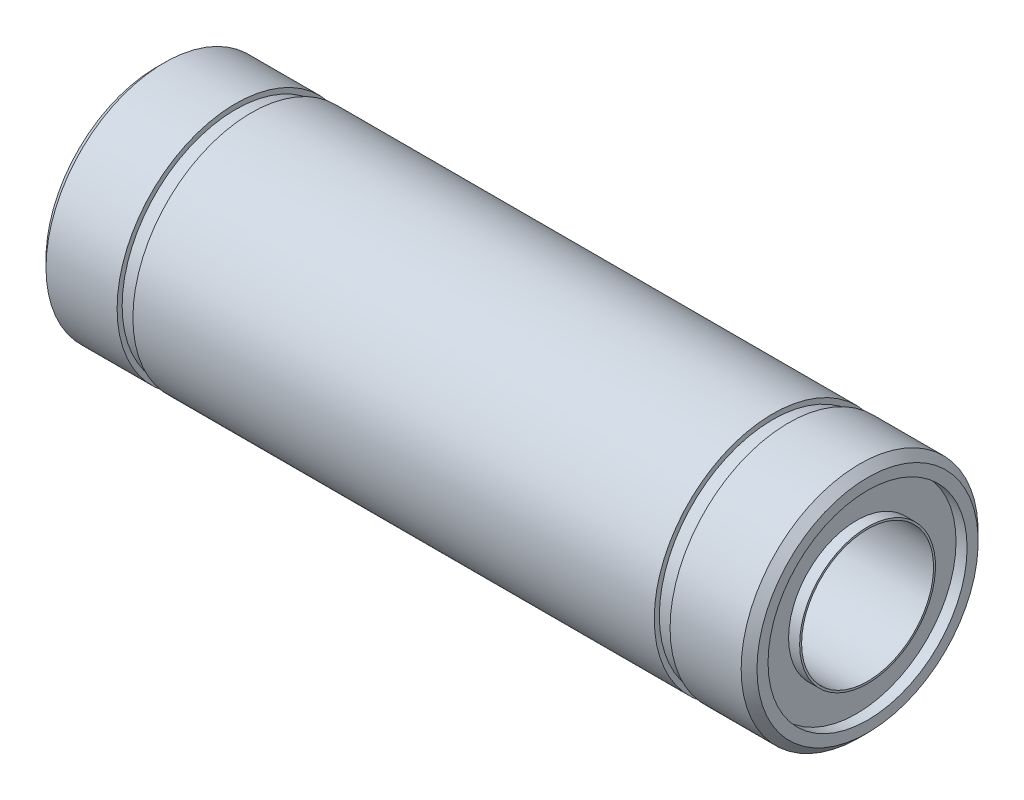
ISO-10303-21;
HEADER;
FILE_DESCRIPTION(('STEP AP214'),'2;1');
FILE_NAME('part.step','',(''),(''),'','','');
FILE_SCHEMA(('AUTOMOTIVE_DESIGN { 1 0 10303 214 1 1 1 1 }'));
ENDSEC;
DATA;
#1=APPLICATION_CONTEXT('core data for automotive mechanical design processes');
#2=APPLICATION_PROTOCOL_DEFINITION('international standard','automotive_design',2000,#1);
#3=PRODUCT_CONTEXT('',#1,'mechanical');
#4=PRODUCT('Part','Part','',(#3));
#5=PRODUCT_RELATED_PRODUCT_CATEGORY('part','',(#4));
#6=PRODUCT_DEFINITION_FORMATION('','',#4);
#7=PRODUCT_DEFINITION_CONTEXT('part definition',#1,'design');
#8=PRODUCT_DEFINITION('design','',#6,#7);
#9=PRODUCT_DEFINITION_SHAPE('','',#8);
#10=(LENGTH_UNIT() NAMED_UNIT(*) SI_UNIT(.MILLI.,.METRE.));
#11=(NAMED_UNIT(*) PLANE_ANGLE_UNIT() SI_UNIT($,.RADIAN.));
#12=(NAMED_UNIT(*) SI_UNIT($,.STERADIAN.) SOLID_ANGLE_UNIT());
#13=UNCERTAINTY_MEASURE_WITH_UNIT(LENGTH_MEASURE(1.E-05),#10,'distance_accuracy_value','');
#14=(GEOMETRIC_REPRESENTATION_CONTEXT(3) GLOBAL_UNCERTAINTY_ASSIGNED_CONTEXT((#13)) GLOBAL_UNIT_ASSIGNED_CONTEXT((#10,
#11,#12)) REPRESENTATION_CONTEXT('',''));
#15=CARTESIAN_POINT('',(0.,0.,0.));
#16=DIRECTION('',(0.,0.,1.));
#17=DIRECTION('',(1.,0.,0.));
#18=AXIS2_PLACEMENT_3D('',#15,#16,#17);
#19=CARTESIAN_POINT('',(0.,7.5,0.));
#20=DIRECTION('',(1.,0.,0.));
#21=DIRECTION('',(0.,0.,-1.));
#22=AXIS2_PLACEMENT_3D('',#19,#20,#21);
#23=PLANE('',#22);
#24=CARTESIAN_POINT('',(0.,0.,0.));
#25=DIRECTION('',(1.,0.,0.));
#26=DIRECTION('',(0.,0.,-1.));
#27=AXIS2_PLACEMENT_3D('',#24,#25,#26);
#28=CIRCLE('',#27,7.);
#29=CARTESIAN_POINT('',(0.,0.,-7.));
#30=VERTEX_POINT('',#29);
#31=EDGE_CURVE('E42',#30,#30,#28,.F.);
#32=ORIENTED_EDGE('',*,*,#31,.T.);
#33=EDGE_LOOP('',(#32));
#34=FACE_BOUND('',#33,.T.);
#35=CARTESIAN_POINT('',(0.,0.,0.));
#36=DIRECTION('',(-1.,0.,0.));
#37=DIRECTION('',(0.,0.,1.));
#38=AXIS2_PLACEMENT_3D('',#35,#36,#37);
#39=CIRCLE('',#38,6.3);
#40=CARTESIAN_POINT('',(0.,0.,6.3));
#41=VERTEX_POINT('',#40);
#42=EDGE_CURVE('E55',#41,#41,#39,.T.);
#43=ORIENTED_EDGE('',*,*,#42,.F.);
#44=EDGE_LOOP('',(#43));
#45=FACE_BOUND('',#44,.T.);
#46=ADVANCED_FACE('F35',(#34,#45),#23,.F.);
#47=CARTESIAN_POINT('',(0.,0.,0.));
#48=DIRECTION('',(-1.,0.,0.));
#49=DIRECTION('',(0.,0.,1.));
#50=AXIS2_PLACEMENT_3D('',#47,#48,#49);
#51=CYLINDRICAL_SURFACE('',#50,6.3);
#52=CARTESIAN_POINT('',(0.7,0.,0.));
#53=DIRECTION('',(-1.,0.,0.));
#54=DIRECTION('',(0.,0.,1.));
#55=AXIS2_PLACEMENT_3D('',#52,#53,#54);
#56=CIRCLE('',#55,6.3);
#57=CARTESIAN_POINT('',(0.7,0.,6.3));
#58=VERTEX_POINT('',#57);
#59=EDGE_CURVE('E58',#58,#58,#56,.T.);
#60=ORIENTED_EDGE('',*,*,#59,.F.);
#61=EDGE_LOOP('',(#60));
#62=FACE_BOUND('',#61,.T.);
#63=ORIENTED_EDGE('',*,*,#42,.T.);
#64=EDGE_LOOP('',(#63));
#65=FACE_BOUND('',#64,.T.);
#66=ADVANCED_FACE('F166',(#62,#65),#51,.F.);
#67=CARTESIAN_POINT('',(0.7,6.3,0.));
#68=DIRECTION('',(1.,0.,0.));
#69=DIRECTION('',(0.,0.,-1.));
#70=AXIS2_PLACEMENT_3D('',#67,#68,#69);
#71=PLANE('',#70);
#72=CARTESIAN_POINT('',(0.7,0.,0.));
#73=DIRECTION('',(-1.,0.,0.));
#74=DIRECTION('',(0.,0.,1.));
#75=AXIS2_PLACEMENT_3D('',#72,#73,#74);
#76=CIRCLE('',#75,4.3);
#77=CARTESIAN_POINT('',(0.7,0.,4.3));
#78=VERTEX_POINT('',#77);
#79=EDGE_CURVE('E61',#78,#78,#76,.T.);
#80=ORIENTED_EDGE('',*,*,#79,.F.);
#81=EDGE_LOOP('',(#80));
#82=FACE_BOUND('',#81,.T.);
#83=ORIENTED_EDGE('',*,*,#59,.T.);
#84=EDGE_LOOP('',(#83));
#85=FACE_BOUND('',#84,.T.);
#86=ADVANCED_FACE('F171',(#82,#85),#71,.F.);
#87=CARTESIAN_POINT('',(0.,0.,0.));
#88=DIRECTION('',(-1.,0.,0.));
#89=DIRECTION('',(0.,0.,1.));
#90=AXIS2_PLACEMENT_3D('',#87,#88,#89);
#91=CYLINDRICAL_SURFACE('',#90,4.3);
#92=CARTESIAN_POINT('',(0.,0.,0.));
#93=DIRECTION('',(-1.,0.,0.));
#94=DIRECTION('',(0.,0.,1.));
#95=AXIS2_PLACEMENT_3D('',#92,#93,#94);
#96=CIRCLE('',#95,4.3);
#97=CARTESIAN_POINT('',(0.,0.,4.3));
#98=VERTEX_POINT('',#97);
#99=EDGE_CURVE('E64',#98,#98,#96,.T.);
#100=ORIENTED_EDGE('',*,*,#99,.F.);
#101=EDGE_LOOP('',(#100));
#102=FACE_BOUND('',#101,.T.);
#103=ORIENTED_EDGE('',*,*,#79,.T.);
#104=EDGE_LOOP('',(#103));
#105=FACE_BOUND('',#104,.T.);
#106=ADVANCED_FACE('F223',(#102,#105),#91,.T.);
#107=CARTESIAN_POINT('',(0.,4.3,0.));
#108=DIRECTION('',(1.,0.,0.));
#109=DIRECTION('',(0.,0.,-1.));
#110=AXIS2_PLACEMENT_3D('',#107,#108,#109);
#111=PLANE('',#110);
#112=CARTESIAN_POINT('',(0.,0.,0.));
#113=DIRECTION('',(-1.,0.,0.));
#114=DIRECTION('',(0.,0.,1.));
#115=AXIS2_PLACEMENT_3D('',#112,#113,#114);
#116=CIRCLE('',#115,4.175);
#117=CARTESIAN_POINT('',(0.,0.,4.175));
#118=VERTEX_POINT('',#117);
#119=EDGE_CURVE('E67',#118,#118,#116,.T.);
#120=ORIENTED_EDGE('',*,*,#119,.F.);
#121=EDGE_LOOP('',(#120));
#122=FACE_BOUND('',#121,.T.);
#123=ORIENTED_EDGE('',*,*,#99,.T.);
#124=EDGE_LOOP('',(#123));
#125=FACE_BOUND('',#124,.T.);
#126=ADVANCED_FACE('F217',(#122,#125),#111,.F.);
#127=CARTESIAN_POINT('',(0.,0.,0.));
#128=DIRECTION('',(-1.,0.,0.));
#129=DIRECTION('',(0.,0.,1.));
#130=AXIS2_PLACEMENT_3D('',#127,#128,#129);
#131=CYLINDRICAL_SURFACE('',#130,4.175);
#132=CARTESIAN_POINT('',(45.,0.,0.));
#133=DIRECTION('',(-1.,0.,0.));
#134=DIRECTION('',(0.,0.,1.));
#135=AXIS2_PLACEMENT_3D('',#132,#133,#134);
#136=CIRCLE('',#135,4.175);
#137=CARTESIAN_POINT('',(45.,0.,4.175));
#138=VERTEX_POINT('',#137);
#139=EDGE_CURVE('E70',#138,#138,#136,.T.);
#140=ORIENTED_EDGE('',*,*,#139,.F.);
#141=EDGE_LOOP('',(#140));
#142=FACE_BOUND('',#141,.T.);
#143=ORIENTED_EDGE('',*,*,#119,.T.);
#144=EDGE_LOOP('',(#143));
#145=FACE_BOUND('',#144,.T.);
#146=ADVANCED_FACE('F211',(#142,#145),#131,.F.);
#147=CARTESIAN_POINT('',(45.,4.3,0.));
#148=DIRECTION('',(-1.,0.,0.));
#149=DIRECTION('',(0.,0.,1.));
#150=AXIS2_PLACEMENT_3D('',#147,#148,#149);
#151=PLANE('',#150);
#152=CARTESIAN_POINT('',(45.,0.,0.));
#153=DIRECTION('',(-1.,0.,0.));
#154=DIRECTION('',(0.,0.,1.));
#155=AXIS2_PLACEMENT_3D('',#152,#153,#154);
#156=CIRCLE('',#155,4.3);
#157=CARTESIAN_POINT('',(45.,0.,4.3));
#158=VERTEX_POINT('',#157);
#159=EDGE_CURVE('E73',#158,#158,#156,.T.);
#160=ORIENTED_EDGE('',*,*,#159,.F.);
#161=EDGE_LOOP('',(#160));
#162=FACE_BOUND('',#161,.T.);
#163=ORIENTED_EDGE('',*,*,#139,.T.);
#164=EDGE_LOOP('',(#163));
#165=FACE_BOUND('',#164,.T.);
#166=ADVANCED_FACE('F205',(#162,#165),#151,.F.);
#167=CARTESIAN_POINT('',(0.,0.,0.));
#168=DIRECTION('',(-1.,0.,0.));
#169=DIRECTION('',(0.,0.,1.));
#170=AXIS2_PLACEMENT_3D('',#167,#168,#169);
#171=CYLINDRICAL_SURFACE('',#170,4.3);
#172=CARTESIAN_POINT('',(44.3,0.,0.));
#173=DIRECTION('',(-1.,0.,0.));
#174=DIRECTION('',(0.,0.,1.));
#175=AXIS2_PLACEMENT_3D('',#172,#173,#174);
#176=CIRCLE('',#175,4.3);
#177=CARTESIAN_POINT('',(44.3,0.,4.3));
#178=VERTEX_POINT('',#177);
#179=EDGE_CURVE('E76',#178,#178,#176,.T.);
#180=ORIENTED_EDGE('',*,*,#179,.F.);
#181=EDGE_LOOP('',(#180));
#182=FACE_BOUND('',#181,.T.);
#183=ORIENTED_EDGE('',*,*,#159,.T.);
#184=EDGE_LOOP('',(#183));
#185=FACE_BOUND('',#184,.T.);
#186=ADVANCED_FACE('F199',(#182,#185),#171,.T.);
#187=CARTESIAN_POINT('',(44.3,6.3,0.));
#188=DIRECTION('',(-1.,0.,0.));
#189=DIRECTION('',(0.,0.,1.));
#190=AXIS2_PLACEMENT_3D('',#187,#188,#189);
#191=PLANE('',#190);
#192=CARTESIAN_POINT('',(44.3,0.,0.));
#193=DIRECTION('',(-1.,0.,0.));
#194=DIRECTION('',(0.,0.,1.));
#195=AXIS2_PLACEMENT_3D('',#192,#193,#194);
#196=CIRCLE('',#195,6.3);
#197=CARTESIAN_POINT('',(44.3,0.,6.3));
#198=VERTEX_POINT('',#197);
#199=EDGE_CURVE('E79',#198,#198,#196,.T.);
#200=ORIENTED_EDGE('',*,*,#199,.F.);
#201=EDGE_LOOP('',(#200));
#202=FACE_BOUND('',#201,.T.);
#203=ORIENTED_EDGE('',*,*,#179,.T.);
#204=EDGE_LOOP('',(#203));
#205=FACE_BOUND('',#204,.T.);
#206=ADVANCED_FACE('F193',(#202,#205),#191,.F.);
#207=CARTESIAN_POINT('',(0.,0.,0.));
#208=DIRECTION('',(-1.,0.,0.));
#209=DIRECTION('',(0.,0.,1.));
#210=AXIS2_PLACEMENT_3D('',#207,#208,#209);
#211=CYLINDRICAL_SURFACE('',#210,6.3);
#212=CARTESIAN_POINT('',(45.,0.,0.));
#213=DIRECTION('',(-1.,0.,0.));
#214=DIRECTION('',(0.,0.,1.));
#215=AXIS2_PLACEMENT_3D('',#212,#213,#214);
#216=CIRCLE('',#215,6.3);
#217=CARTESIAN_POINT('',(45.,0.,6.3));
#218=VERTEX_POINT('',#217);
#219=EDGE_CURVE('E82',#218,#218,#216,.T.);
#220=ORIENTED_EDGE('',*,*,#219,.F.);
#221=EDGE_LOOP('',(#220));
#222=FACE_BOUND('',#221,.T.);
#223=ORIENTED_EDGE('',*,*,#199,.T.);
#224=EDGE_LOOP('',(#223));
#225=FACE_BOUND('',#224,.T.);
#226=ADVANCED_FACE('F162',(#222,#225),#211,.F.);
#227=CARTESIAN_POINT('',(45.,7.5,0.));
#228=DIRECTION('',(-1.,0.,0.));
#229=DIRECTION('',(0.,0.,1.));
#230=AXIS2_PLACEMENT_3D('',#227,#228,#229);
#231=PLANE('',#230);
#232=CARTESIAN_POINT('',(45.,0.,0.));
#233=DIRECTION('',(-1.,0.,0.));
#234=DIRECTION('',(0.,0.,1.));
#235=AXIS2_PLACEMENT_3D('',#232,#233,#234);
#236=CIRCLE('',#235,7.00000000000001);
#237=CARTESIAN_POINT('',(45.,0.,7.00000000000001));
#238=VERTEX_POINT('',#237);
#239=EDGE_CURVE('E46',#238,#238,#236,.F.);
#240=ORIENTED_EDGE('',*,*,#239,.T.);
#241=EDGE_LOOP('',(#240));
#242=FACE_BOUND('',#241,.T.);
#243=ORIENTED_EDGE('',*,*,#219,.T.);
#244=EDGE_LOOP('',(#243));
#245=FACE_BOUND('',#244,.T.);
#246=ADVANCED_FACE('F156',(#242,#245),#231,.F.);
#247=CARTESIAN_POINT('',(0.,0.,0.));
#248=DIRECTION('',(-1.,0.,0.));
#249=DIRECTION('',(0.,0.,1.));
#250=AXIS2_PLACEMENT_3D('',#247,#248,#249);
#251=CYLINDRICAL_SURFACE('',#250,7.5);
#252=CARTESIAN_POINT('',(44.5,0.,0.));
#253=DIRECTION('',(-1.,0.,0.));
#254=DIRECTION('',(0.,0.,1.));
#255=AXIS2_PLACEMENT_3D('',#252,#253,#254);
#256=CIRCLE('',#255,7.5);
#257=CARTESIAN_POINT('',(44.5,0.,7.5));
#258=VERTEX_POINT('',#257);
#259=EDGE_CURVE('E50',#258,#258,#256,.T.);
#260=ORIENTED_EDGE('',*,*,#259,.T.);
#261=EDGE_LOOP('',(#260));
#262=FACE_BOUND('',#261,.T.);
#263=CARTESIAN_POINT('',(40.,0.,0.));
#264=DIRECTION('',(-1.,0.,0.));
#265=DIRECTION('',(0.,0.,1.));
#266=AXIS2_PLACEMENT_3D('',#263,#264,#265);
#267=CIRCLE('',#266,7.5);
#268=CARTESIAN_POINT('',(40.,0.,7.5));
#269=VERTEX_POINT('',#268);
#270=EDGE_CURVE('E85',#269,#269,#267,.T.);
#271=ORIENTED_EDGE('',*,*,#270,.F.);
#272=EDGE_LOOP('',(#271));
#273=FACE_BOUND('',#272,.T.);
#274=ADVANCED_FACE('F151',(#262,#273),#251,.T.);
#275=CARTESIAN_POINT('',(40.,7.5,0.));
#276=DIRECTION('',(1.,0.,0.));
#277=DIRECTION('',(0.,0.,-1.));
#278=AXIS2_PLACEMENT_3D('',#275,#276,#277);
#279=PLANE('',#278);
#280=CARTESIAN_POINT('',(40.,0.,0.));
#281=DIRECTION('',(-1.,0.,0.));
#282=DIRECTION('',(0.,0.,1.));
#283=AXIS2_PLACEMENT_3D('',#280,#281,#282);
#284=CIRCLE('',#283,7.18);
#285=CARTESIAN_POINT('',(40.,0.,7.18));
#286=VERTEX_POINT('',#285);
#287=EDGE_CURVE('E88',#286,#286,#284,.T.);
#288=ORIENTED_EDGE('',*,*,#287,.F.);
#289=EDGE_LOOP('',(#288));
#290=FACE_BOUND('',#289,.T.);
#291=ORIENTED_EDGE('',*,*,#270,.T.);
#292=EDGE_LOOP('',(#291));
#293=FACE_BOUND('',#292,.T.);
#294=ADVANCED_FACE('F145',(#290,#293),#279,.F.);
#295=CARTESIAN_POINT('',(0.,0.,0.));
#296=DIRECTION('',(-1.,0.,0.));
#297=DIRECTION('',(0.,0.,1.));
#298=AXIS2_PLACEMENT_3D('',#295,#296,#297);
#299=CYLINDRICAL_SURFACE('',#298,7.18);
#300=CARTESIAN_POINT('',(39.,0.,0.));
#301=DIRECTION('',(-1.,0.,0.));
#302=DIRECTION('',(0.,0.,1.));
#303=AXIS2_PLACEMENT_3D('',#300,#301,#302);
#304=CIRCLE('',#303,7.18);
#305=CARTESIAN_POINT('',(39.,0.,7.18));
#306=VERTEX_POINT('',#305);
#307=EDGE_CURVE('E91',#306,#306,#304,.T.);
#308=ORIENTED_EDGE('',*,*,#307,.F.);
#309=EDGE_LOOP('',(#308));
#310=FACE_BOUND('',#309,.T.);
#311=ORIENTED_EDGE('',*,*,#287,.T.);
#312=EDGE_LOOP('',(#311));
#313=FACE_BOUND('',#312,.T.);
#314=ADVANCED_FACE('F139',(#310,#313),#299,.T.);
#315=CARTESIAN_POINT('',(39.,7.5,0.));
#316=DIRECTION('',(-1.,0.,0.));
#317=DIRECTION('',(0.,0.,1.));
#318=AXIS2_PLACEMENT_3D('',#315,#316,#317);
#319=PLANE('',#318);
#320=CARTESIAN_POINT('',(39.,0.,0.));
#321=DIRECTION('',(-1.,0.,0.));
#322=DIRECTION('',(0.,0.,1.));
#323=AXIS2_PLACEMENT_3D('',#320,#321,#322);
#324=CIRCLE('',#323,7.5);
#325=CARTESIAN_POINT('',(39.,0.,7.5));
#326=VERTEX_POINT('',#325);
#327=EDGE_CURVE('E94',#326,#326,#324,.T.);
#328=ORIENTED_EDGE('',*,*,#327,.F.);
#329=EDGE_LOOP('',(#328));
#330=FACE_BOUND('',#329,.T.);
#331=ORIENTED_EDGE('',*,*,#307,.T.);
#332=EDGE_LOOP('',(#331));
#333=FACE_BOUND('',#332,.T.);
#334=ADVANCED_FACE('F133',(#330,#333),#319,.F.);
#335=CARTESIAN_POINT('',(0.,0.,0.));
#336=DIRECTION('',(-1.,0.,0.));
#337=DIRECTION('',(0.,0.,1.));
#338=AXIS2_PLACEMENT_3D('',#335,#336,#337);
#339=CYLINDRICAL_SURFACE('',#338,7.5);
#340=CARTESIAN_POINT('',(6.,0.,0.));
#341=DIRECTION('',(-1.,0.,0.));
#342=DIRECTION('',(0.,0.,1.));
#343=AXIS2_PLACEMENT_3D('',#340,#341,#342);
#344=CIRCLE('',#343,7.5);
#345=CARTESIAN_POINT('',(6.,0.,7.5));
#346=VERTEX_POINT('',#345);
#347=EDGE_CURVE('E97',#346,#346,#344,.T.);
#348=ORIENTED_EDGE('',*,*,#347,.F.);
#349=EDGE_LOOP('',(#348));
#350=FACE_BOUND('',#349,.T.);
#351=ORIENTED_EDGE('',*,*,#327,.T.);
#352=EDGE_LOOP('',(#351));
#353=FACE_BOUND('',#352,.T.);
#354=ADVANCED_FACE('F127',(#350,#353),#339,.T.);
#355=CARTESIAN_POINT('',(6.,7.5,0.));
#356=DIRECTION('',(1.,0.,0.));
#357=DIRECTION('',(0.,0.,-1.));
#358=AXIS2_PLACEMENT_3D('',#355,#356,#357);
#359=PLANE('',#358);
#360=CARTESIAN_POINT('',(6.,0.,0.));
#361=DIRECTION('',(-1.,0.,0.));
#362=DIRECTION('',(0.,0.,1.));
#363=AXIS2_PLACEMENT_3D('',#360,#361,#362);
#364=CIRCLE('',#363,7.18);
#365=CARTESIAN_POINT('',(6.,0.,7.18));
#366=VERTEX_POINT('',#365);
#367=EDGE_CURVE('E100',#366,#366,#364,.T.);
#368=ORIENTED_EDGE('',*,*,#367,.F.);
#369=EDGE_LOOP('',(#368));
#370=FACE_BOUND('',#369,.T.);
#371=ORIENTED_EDGE('',*,*,#347,.T.);
#372=EDGE_LOOP('',(#371));
#373=FACE_BOUND('',#372,.T.);
#374=ADVANCED_FACE('F121',(#370,#373),#359,.F.);
#375=CARTESIAN_POINT('',(0.,0.,0.));
#376=DIRECTION('',(-1.,0.,0.));
#377=DIRECTION('',(0.,0.,1.));
#378=AXIS2_PLACEMENT_3D('',#375,#376,#377);
#379=CYLINDRICAL_SURFACE('',#378,7.18);
#380=CARTESIAN_POINT('',(5.,0.,0.));
#381=DIRECTION('',(-1.,0.,0.));
#382=DIRECTION('',(0.,0.,1.));
#383=AXIS2_PLACEMENT_3D('',#380,#381,#382);
#384=CIRCLE('',#383,7.18);
#385=CARTESIAN_POINT('',(5.,0.,7.18));
#386=VERTEX_POINT('',#385);
#387=EDGE_CURVE('E103',#386,#386,#384,.T.);
#388=ORIENTED_EDGE('',*,*,#387,.F.);
#389=EDGE_LOOP('',(#388));
#390=FACE_BOUND('',#389,.T.);
#391=ORIENTED_EDGE('',*,*,#367,.T.);
#392=EDGE_LOOP('',(#391));
#393=FACE_BOUND('',#392,.T.);
#394=ADVANCED_FACE('F115',(#390,#393),#379,.T.);
#395=CARTESIAN_POINT('',(5.,7.5,0.));
#396=DIRECTION('',(-1.,0.,0.));
#397=DIRECTION('',(0.,0.,1.));
#398=AXIS2_PLACEMENT_3D('',#395,#396,#397);
#399=PLANE('',#398);
#400=CARTESIAN_POINT('',(5.,0.,0.));
#401=DIRECTION('',(-1.,0.,0.));
#402=DIRECTION('',(0.,0.,1.));
#403=AXIS2_PLACEMENT_3D('',#400,#401,#402);
#404=CIRCLE('',#403,7.5);
#405=CARTESIAN_POINT('',(5.,0.,7.5));
#406=VERTEX_POINT('',#405);
#407=EDGE_CURVE('E106',#406,#406,#404,.T.);
#408=ORIENTED_EDGE('',*,*,#407,.F.);
#409=EDGE_LOOP('',(#408));
#410=FACE_BOUND('',#409,.T.);
#411=ORIENTED_EDGE('',*,*,#387,.T.);
#412=EDGE_LOOP('',(#411));
#413=FACE_BOUND('',#412,.T.);
#414=ADVANCED_FACE('F112',(#410,#413),#399,.F.);
#415=CARTESIAN_POINT('',(0.,0.,0.));
#416=DIRECTION('',(-1.,0.,0.));
#417=DIRECTION('',(0.,0.,1.));
#418=AXIS2_PLACEMENT_3D('',#415,#416,#417);
#419=CYLINDRICAL_SURFACE('',#418,7.5);
#420=CARTESIAN_POINT('',(0.500000000000006,0.,0.));
#421=DIRECTION('',(1.,0.,0.));
#422=DIRECTION('',(0.,0.,-1.));
#423=AXIS2_PLACEMENT_3D('',#420,#421,#422);
#424=CIRCLE('',#423,7.5);
#425=CARTESIAN_POINT('',(0.500000000000006,0.,-7.5));
#426=VERTEX_POINT('',#425);
#427=EDGE_CURVE('E10',#426,#426,#424,.T.);
#428=ORIENTED_EDGE('',*,*,#427,.T.);
#429=EDGE_LOOP('',(#428));
#430=FACE_BOUND('',#429,.T.);
#431=ORIENTED_EDGE('',*,*,#407,.T.);
#432=EDGE_LOOP('',(#431));
#433=FACE_BOUND('',#432,.T.);
#434=ADVANCED_FACE('F110',(#430,#433),#419,.T.);
#435=CARTESIAN_POINT('',(44.5,0.,0.));
#436=DIRECTION('',(-1.,0.,0.));
#437=DIRECTION('',(0.,0.,1.));
#438=AXIS2_PLACEMENT_3D('',#435,#436,#437);
#439=CONICAL_SURFACE('',#438,7.5,0.785398163397446);
#440=ORIENTED_EDGE('',*,*,#239,.F.);
#441=EDGE_LOOP('',(#440));
#442=FACE_BOUND('',#441,.T.);
#443=ORIENTED_EDGE('',*,*,#259,.F.);
#444=EDGE_LOOP('',(#443));
#445=FACE_BOUND('',#444,.T.);
#446=ADVANCED_FACE('F176',(#442,#445),#439,.T.);
#447=CARTESIAN_POINT('',(0.,0.,0.));
#448=DIRECTION('',(1.,0.,0.));
#449=DIRECTION('',(0.,0.,-1.));
#450=AXIS2_PLACEMENT_3D('',#447,#448,#449);
#451=CONICAL_SURFACE('',#450,7.,0.785398163397444);
#452=ORIENTED_EDGE('',*,*,#427,.F.);
#453=EDGE_LOOP('',(#452));
#454=FACE_BOUND('',#453,.T.);
#455=ORIENTED_EDGE('',*,*,#31,.F.);
#456=EDGE_LOOP('',(#455));
#457=FACE_BOUND('',#456,.T.);
#458=ADVANCED_FACE('F37',(#454,#457),#451,.T.);
#459=CLOSED_SHELL('',(#46,#66,#86,#106,#126,#146,#166,#186,#206,#226,#246,#274,#294,#314,#334,
#354,#374,#394,#414,#434,#446,#458));
#460=MANIFOLD_SOLID_BREP('B2',#459);
#461=ADVANCED_BREP_SHAPE_REPRESENTATION('',(#18,#460),#14);
#462=SHAPE_DEFINITION_REPRESENTATION(#9,#461);
ENDSEC;
END-ISO-10303-21;
